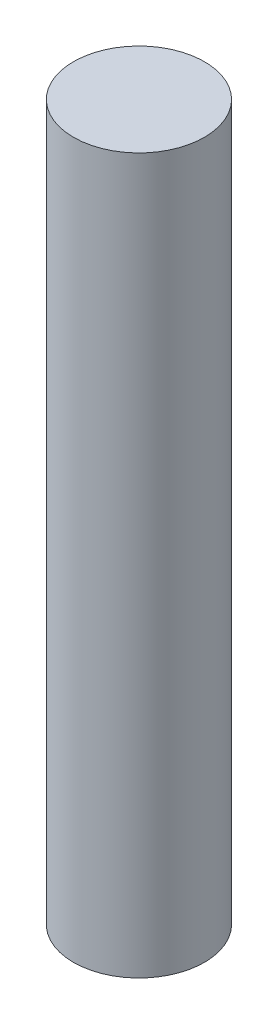
ISO-10303-21;
HEADER;
FILE_DESCRIPTION(('STEP AP214'),'2;1');
FILE_NAME('part.step','',(''),(''),'','','');
FILE_SCHEMA(('AUTOMOTIVE_DESIGN { 1 0 10303 214 1 1 1 1 }'));
ENDSEC;
DATA;
#1=APPLICATION_CONTEXT('core data for automotive mechanical design processes');
#2=APPLICATION_PROTOCOL_DEFINITION('international standard','automotive_design',2000,#1);
#3=PRODUCT_CONTEXT('',#1,'mechanical');
#4=PRODUCT('Part','Part','',(#3));
#5=PRODUCT_RELATED_PRODUCT_CATEGORY('part','',(#4));
#6=PRODUCT_DEFINITION_FORMATION('','',#4);
#7=PRODUCT_DEFINITION_CONTEXT('part definition',#1,'design');
#8=PRODUCT_DEFINITION('design','',#6,#7);
#9=PRODUCT_DEFINITION_SHAPE('','',#8);
#10=(LENGTH_UNIT() NAMED_UNIT(*) SI_UNIT(.MILLI.,.METRE.));
#11=(NAMED_UNIT(*) PLANE_ANGLE_UNIT() SI_UNIT($,.RADIAN.));
#12=(NAMED_UNIT(*) SI_UNIT($,.STERADIAN.) SOLID_ANGLE_UNIT());
#13=UNCERTAINTY_MEASURE_WITH_UNIT(LENGTH_MEASURE(1.E-05),#10,'distance_accuracy_value','');
#14=(GEOMETRIC_REPRESENTATION_CONTEXT(3) GLOBAL_UNCERTAINTY_ASSIGNED_CONTEXT((#13)) GLOBAL_UNIT_ASSIGNED_CONTEXT((#10,
#11,#12)) REPRESENTATION_CONTEXT('',''));
#15=CARTESIAN_POINT('',(0.,0.,0.));
#16=DIRECTION('',(0.,0.,1.));
#17=DIRECTION('',(1.,0.,0.));
#18=AXIS2_PLACEMENT_3D('',#15,#16,#17);
#19=CARTESIAN_POINT('',(0.,300.,0.));
#20=DIRECTION('',(0.,-1.,0.));
#21=DIRECTION('',(0.,0.,-1.));
#22=AXIS2_PLACEMENT_3D('',#19,#20,#21);
#23=CYLINDRICAL_SURFACE('',#22,27.5);
#24=CARTESIAN_POINT('',(0.,300.,0.));
#25=DIRECTION('',(0.,1.,0.));
#26=DIRECTION('',(0.,0.,1.));
#27=AXIS2_PLACEMENT_3D('',#24,#25,#26);
#28=CIRCLE('',#27,27.5);
#29=CARTESIAN_POINT('',(0.,300.,27.5));
#30=VERTEX_POINT('',#29);
#31=EDGE_CURVE('E10',#30,#30,#28,.T.);
#32=ORIENTED_EDGE('',*,*,#31,.F.);
#33=EDGE_LOOP('',(#32));
#34=FACE_BOUND('',#33,.T.);
#35=CARTESIAN_POINT('',(0.,0.,0.));
#36=DIRECTION('',(0.,1.,0.));
#37=DIRECTION('',(0.,0.,1.));
#38=AXIS2_PLACEMENT_3D('',#35,#36,#37);
#39=CIRCLE('',#38,27.5);
#40=CARTESIAN_POINT('',(0.,0.,27.5));
#41=VERTEX_POINT('',#40);
#42=EDGE_CURVE('E34',#41,#41,#39,.T.);
#43=ORIENTED_EDGE('',*,*,#42,.T.);
#44=EDGE_LOOP('',(#43));
#45=FACE_BOUND('',#44,.T.);
#46=ADVANCED_FACE('F31',(#34,#45),#23,.T.);
#47=CARTESIAN_POINT('',(0.,300.,0.));
#48=DIRECTION('',(0.,1.,0.));
#49=DIRECTION('',(0.,0.,1.));
#50=AXIS2_PLACEMENT_3D('',#47,#48,#49);
#51=PLANE('',#50);
#52=ORIENTED_EDGE('',*,*,#31,.T.);
#53=EDGE_LOOP('',(#52));
#54=FACE_BOUND('',#53,.T.);
#55=ADVANCED_FACE('F46',(#54),#51,.T.);
#56=CARTESIAN_POINT('',(0.,0.,0.));
#57=DIRECTION('',(0.,1.,0.));
#58=DIRECTION('',(0.,0.,1.));
#59=AXIS2_PLACEMENT_3D('',#56,#57,#58);
#60=PLANE('',#59);
#61=ORIENTED_EDGE('',*,*,#42,.F.);
#62=EDGE_LOOP('',(#61));
#63=FACE_BOUND('',#62,.T.);
#64=ADVANCED_FACE('F44',(#63),#60,.F.);
#65=CLOSED_SHELL('',(#46,#55,#64));
#66=MANIFOLD_SOLID_BREP('B2',#65);
#67=ADVANCED_BREP_SHAPE_REPRESENTATION('',(#18,#66),#14);
#68=SHAPE_DEFINITION_REPRESENTATION(#9,#67);
ENDSEC;
END-ISO-10303-21;
